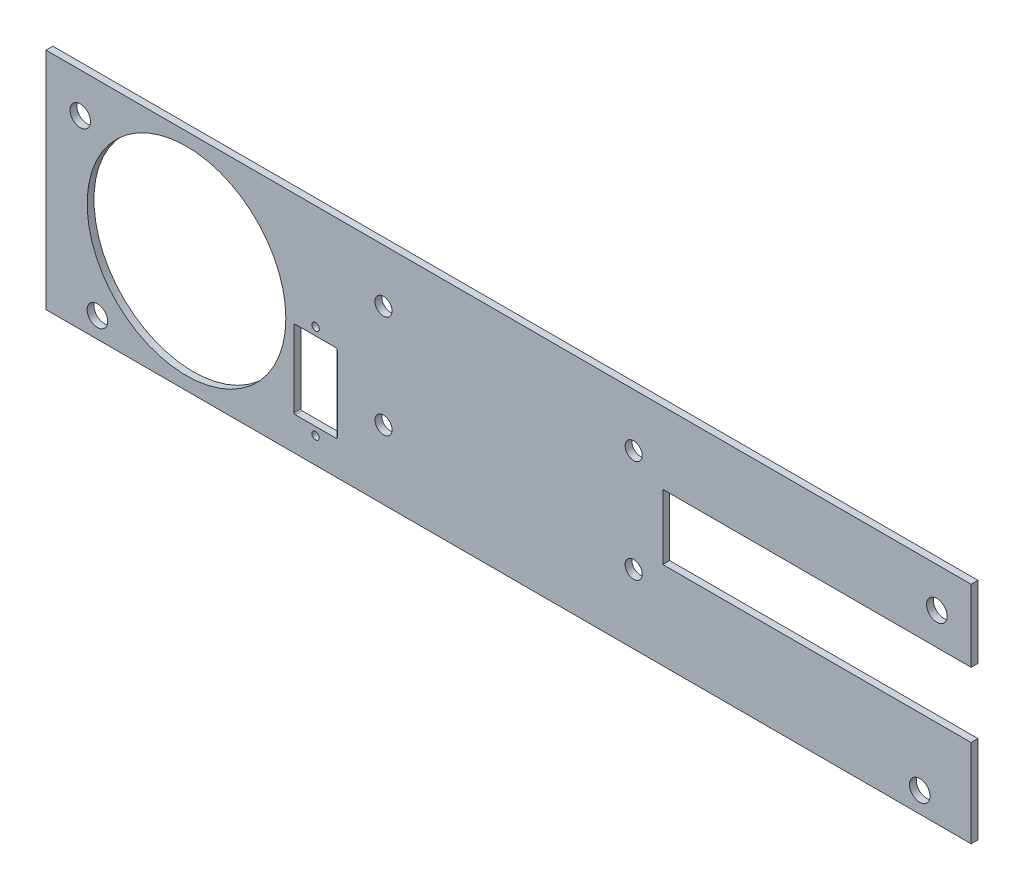
ISO-10303-21;
HEADER;
FILE_DESCRIPTION(('STEP AP214'),'2;1');
FILE_NAME('part.step','',(''),(''),'','','');
FILE_SCHEMA(('AUTOMOTIVE_DESIGN { 1 0 10303 214 1 1 1 1 }'));
ENDSEC;
DATA;
#1=APPLICATION_CONTEXT('core data for automotive mechanical design processes');
#2=APPLICATION_PROTOCOL_DEFINITION('international standard','automotive_design',2000,#1);
#3=PRODUCT_CONTEXT('',#1,'mechanical');
#4=PRODUCT('Part','Part','',(#3));
#5=PRODUCT_RELATED_PRODUCT_CATEGORY('part','',(#4));
#6=PRODUCT_DEFINITION_FORMATION('','',#4);
#7=PRODUCT_DEFINITION_CONTEXT('part definition',#1,'design');
#8=PRODUCT_DEFINITION('design','',#6,#7);
#9=PRODUCT_DEFINITION_SHAPE('','',#8);
#10=(LENGTH_UNIT() NAMED_UNIT(*) SI_UNIT(.MILLI.,.METRE.));
#11=(NAMED_UNIT(*) PLANE_ANGLE_UNIT() SI_UNIT($,.RADIAN.));
#12=(NAMED_UNIT(*) SI_UNIT($,.STERADIAN.) SOLID_ANGLE_UNIT());
#13=UNCERTAINTY_MEASURE_WITH_UNIT(LENGTH_MEASURE(1.E-05),#10,'distance_accuracy_value','');
#14=(GEOMETRIC_REPRESENTATION_CONTEXT(3) GLOBAL_UNCERTAINTY_ASSIGNED_CONTEXT((#13)) GLOBAL_UNIT_ASSIGNED_CONTEXT((#10,
#11,#12)) REPRESENTATION_CONTEXT('',''));
#15=CARTESIAN_POINT('',(0.,0.,0.));
#16=DIRECTION('',(0.,0.,1.));
#17=DIRECTION('',(1.,0.,0.));
#18=AXIS2_PLACEMENT_3D('',#15,#16,#17);
#19=CARTESIAN_POINT('',(135.,30.,2.));
#20=DIRECTION('',(-1.,0.,0.));
#21=DIRECTION('',(0.,0.,1.));
#22=AXIS2_PLACEMENT_3D('',#19,#20,#21);
#23=PLANE('',#22);
#24=DIRECTION('',(0.,1.,0.));
#25=VECTOR('',#24,1.);
#26=CARTESIAN_POINT('',(135.,30.,2.));
#27=LINE('',#26,#25);
#28=CARTESIAN_POINT('',(135.,14.6,2.));
#29=VERTEX_POINT('',#28);
#30=CARTESIAN_POINT('',(135.,35.6,2.));
#31=VERTEX_POINT('',#30);
#32=EDGE_CURVE('E314',#29,#31,#27,.T.);
#33=ORIENTED_EDGE('',*,*,#32,.F.);
#34=DIRECTION('',(0.,0.,-1.));
#35=VECTOR('',#34,1.);
#36=CARTESIAN_POINT('',(135.,14.6,2.));
#37=LINE('',#36,#35);
#38=CARTESIAN_POINT('',(135.,14.6,0.));
#39=VERTEX_POINT('',#38);
#40=EDGE_CURVE('E247',#29,#39,#37,.T.);
#41=ORIENTED_EDGE('',*,*,#40,.T.);
#42=DIRECTION('',(0.,1.,0.));
#43=VECTOR('',#42,1.);
#44=CARTESIAN_POINT('',(135.,30.,0.));
#45=LINE('',#44,#43);
#46=CARTESIAN_POINT('',(135.,35.6,0.));
#47=VERTEX_POINT('',#46);
#48=EDGE_CURVE('E309',#39,#47,#45,.T.);
#49=ORIENTED_EDGE('',*,*,#48,.T.);
#50=DIRECTION('',(0.,0.,1.));
#51=VECTOR('',#50,1.);
#52=CARTESIAN_POINT('',(135.,35.6,0.));
#53=LINE('',#52,#51);
#54=EDGE_CURVE('E303',#47,#31,#53,.T.);
#55=ORIENTED_EDGE('',*,*,#54,.T.);
#56=EDGE_LOOP('',(#33,#41,#49,#55));
#57=FACE_BOUND('',#56,.T.);
#58=ADVANCED_FACE('F33',(#57),#23,.F.);
#59=CARTESIAN_POINT('',(135.,-30.,0.));
#60=VERTEX_POINT('',#59);
#61=CARTESIAN_POINT('',(135.,-4.4,0.));
#62=VERTEX_POINT('',#61);
#63=EDGE_CURVE('E319',#60,#62,#45,.T.);
#64=ORIENTED_EDGE('',*,*,#63,.T.);
#65=DIRECTION('',(0.,0.,1.));
#66=VECTOR('',#65,1.);
#67=CARTESIAN_POINT('',(135.,-4.4,-8.));
#68=LINE('',#67,#66);
#69=CARTESIAN_POINT('',(135.,-4.4,2.));
#70=VERTEX_POINT('',#69);
#71=EDGE_CURVE('E165',#62,#70,#68,.T.);
#72=ORIENTED_EDGE('',*,*,#71,.T.);
#73=CARTESIAN_POINT('',(135.,-30.,2.));
#74=VERTEX_POINT('',#73);
#75=EDGE_CURVE('E171',#74,#70,#27,.T.);
#76=ORIENTED_EDGE('',*,*,#75,.F.);
#77=DIRECTION('',(0.,0.,-1.));
#78=VECTOR('',#77,1.);
#79=CARTESIAN_POINT('',(135.,-30.,2.));
#80=LINE('',#79,#78);
#81=EDGE_CURVE('E318',#74,#60,#80,.T.);
#82=ORIENTED_EDGE('',*,*,#81,.T.);
#83=EDGE_LOOP('',(#64,#72,#76,#82));
#84=FACE_BOUND('',#83,.T.);
#85=ADVANCED_FACE('F35',(#84),#23,.F.);
#86=CARTESIAN_POINT('',(-135.,30.,2.));
#87=DIRECTION('',(1.,0.,0.));
#88=DIRECTION('',(0.,0.,-1.));
#89=AXIS2_PLACEMENT_3D('',#86,#87,#88);
#90=PLANE('',#89);
#91=DIRECTION('',(0.,-1.,0.));
#92=VECTOR('',#91,1.);
#93=CARTESIAN_POINT('',(-135.,30.,0.));
#94=LINE('',#93,#92);
#95=CARTESIAN_POINT('',(-135.,35.6,0.));
#96=VERTEX_POINT('',#95);
#97=CARTESIAN_POINT('',(-135.,-30.,0.));
#98=VERTEX_POINT('',#97);
#99=EDGE_CURVE('E322',#96,#98,#94,.T.);
#100=ORIENTED_EDGE('',*,*,#99,.T.);
#101=DIRECTION('',(0.,0.,-1.));
#102=VECTOR('',#101,1.);
#103=CARTESIAN_POINT('',(-135.,-30.,2.));
#104=LINE('',#103,#102);
#105=CARTESIAN_POINT('',(-135.,-30.,2.));
#106=VERTEX_POINT('',#105);
#107=EDGE_CURVE('E41',#106,#98,#104,.T.);
#108=ORIENTED_EDGE('',*,*,#107,.F.);
#109=DIRECTION('',(0.,-1.,0.));
#110=VECTOR('',#109,1.);
#111=CARTESIAN_POINT('',(-135.,30.,2.));
#112=LINE('',#111,#110);
#113=CARTESIAN_POINT('',(-135.,35.6,2.));
#114=VERTEX_POINT('',#113);
#115=EDGE_CURVE('E313',#114,#106,#112,.T.);
#116=ORIENTED_EDGE('',*,*,#115,.F.);
#117=DIRECTION('',(0.,0.,1.));
#118=VECTOR('',#117,1.);
#119=CARTESIAN_POINT('',(-135.,35.6,0.));
#120=LINE('',#119,#118);
#121=EDGE_CURVE('E306',#96,#114,#120,.T.);
#122=ORIENTED_EDGE('',*,*,#121,.F.);
#123=EDGE_LOOP('',(#100,#108,#116,#122));
#124=FACE_BOUND('',#123,.T.);
#125=ADVANCED_FACE('F354',(#124),#90,.F.);
#126=CARTESIAN_POINT('',(-135.,-30.,2.));
#127=DIRECTION('',(0.,1.,0.));
#128=DIRECTION('',(0.,0.,1.));
#129=AXIS2_PLACEMENT_3D('',#126,#127,#128);
#130=PLANE('',#129);
#131=DIRECTION('',(1.,0.,0.));
#132=VECTOR('',#131,1.);
#133=CARTESIAN_POINT('',(-135.,-30.,0.));
#134=LINE('',#133,#132);
#135=EDGE_CURVE('E324',#98,#60,#134,.T.);
#136=ORIENTED_EDGE('',*,*,#135,.T.);
#137=ORIENTED_EDGE('',*,*,#81,.F.);
#138=DIRECTION('',(1.,0.,0.));
#139=VECTOR('',#138,1.);
#140=CARTESIAN_POINT('',(-135.,-30.,2.));
#141=LINE('',#140,#139);
#142=EDGE_CURVE('E316',#106,#74,#141,.T.);
#143=ORIENTED_EDGE('',*,*,#142,.F.);
#144=ORIENTED_EDGE('',*,*,#107,.T.);
#145=EDGE_LOOP('',(#136,#137,#143,#144));
#146=FACE_BOUND('',#145,.T.);
#147=ADVANCED_FACE('F372',(#146),#130,.F.);
#148=CARTESIAN_POINT('',(0.,0.,2.));
#149=DIRECTION('',(0.,0.,1.));
#150=DIRECTION('',(1.,0.,0.));
#151=AXIS2_PLACEMENT_3D('',#148,#149,#150);
#152=PLANE('',#151);
#153=DIRECTION('',(1.,0.,0.));
#154=VECTOR('',#153,1.);
#155=CARTESIAN_POINT('',(135.,-4.4,2.));
#156=LINE('',#155,#154);
#157=CARTESIAN_POINT('',(45.,-4.40000000000001,2.));
#158=VERTEX_POINT('',#157);
#159=EDGE_CURVE('E163',#158,#70,#156,.T.);
#160=ORIENTED_EDGE('',*,*,#159,.F.);
#161=DIRECTION('',(0.,1.,0.));
#162=VECTOR('',#161,1.);
#163=CARTESIAN_POINT('',(45.,4.6,2.));
#164=LINE('',#163,#162);
#165=CARTESIAN_POINT('',(45.,14.6,2.));
#166=VERTEX_POINT('',#165);
#167=EDGE_CURVE('E147',#158,#166,#164,.T.);
#168=ORIENTED_EDGE('',*,*,#167,.T.);
#169=DIRECTION('',(1.,0.,0.));
#170=VECTOR('',#169,1.);
#171=CARTESIAN_POINT('',(135.,14.6,2.));
#172=LINE('',#171,#170);
#173=EDGE_CURVE('E157',#166,#29,#172,.T.);
#174=ORIENTED_EDGE('',*,*,#173,.T.);
#175=ORIENTED_EDGE('',*,*,#32,.T.);
#176=DIRECTION('',(-1.,0.,0.));
#177=VECTOR('',#176,1.);
#178=CARTESIAN_POINT('',(-135.,35.6,2.));
#179=LINE('',#178,#177);
#180=EDGE_CURVE('E297',#31,#114,#179,.T.);
#181=ORIENTED_EDGE('',*,*,#180,.T.);
#182=ORIENTED_EDGE('',*,*,#115,.T.);
#183=ORIENTED_EDGE('',*,*,#142,.T.);
#184=ORIENTED_EDGE('',*,*,#75,.T.);
#185=EDGE_LOOP('',(#160,#168,#174,#175,#181,#182,#183,#184));
#186=FACE_BOUND('',#185,.T.);
#187=CARTESIAN_POINT('',(-56.3119000000001,-22.5108,2.));
#188=DIRECTION('',(0.,0.,1.));
#189=DIRECTION('',(1.,0.,0.));
#190=AXIS2_PLACEMENT_3D('',#187,#188,#189);
#191=CIRCLE('',#190,1.06680000000001);
#192=CARTESIAN_POINT('',(-55.2451000000001,-22.5108,2.));
#193=VERTEX_POINT('',#192);
#194=EDGE_CURVE('E184',#193,#193,#191,.T.);
#195=ORIENTED_EDGE('',*,*,#194,.F.);
#196=EDGE_LOOP('',(#195));
#197=FACE_BOUND('',#196,.T.);
#198=CARTESIAN_POINT('',(-56.3119,5.0228,2.));
#199=DIRECTION('',(0.,0.,1.));
#200=DIRECTION('',(1.,0.,0.));
#201=AXIS2_PLACEMENT_3D('',#198,#199,#200);
#202=CIRCLE('',#201,1.06680000000002);
#203=CARTESIAN_POINT('',(-55.2451,5.0228,2.));
#204=VERTEX_POINT('',#203);
#205=EDGE_CURVE('E179',#204,#204,#202,.T.);
#206=ORIENTED_EDGE('',*,*,#205,.F.);
#207=EDGE_LOOP('',(#206));
#208=FACE_BOUND('',#207,.T.);
#209=CARTESIAN_POINT('',(-62.2428000000001,2.30499999999999,2.));
#210=DIRECTION('',(0.,0.,1.));
#211=DIRECTION('',(1.,0.,0.));
#212=AXIS2_PLACEMENT_3D('',#209,#210,#211);
#213=CIRCLE('',#212,0.380999999999999);
#214=CARTESIAN_POINT('',(-62.2428,2.68599999999999,2.));
#215=VERTEX_POINT('',#214);
#216=CARTESIAN_POINT('',(-62.6238,2.30499999999999,2.));
#217=VERTEX_POINT('',#216);
#218=EDGE_CURVE('E237',#215,#217,#213,.T.);
#219=ORIENTED_EDGE('',*,*,#218,.F.);
#220=DIRECTION('',(-1.,0.,0.));
#221=VECTOR('',#220,1.);
#222=CARTESIAN_POINT('',(0.,2.68599999999999,2.));
#223=LINE('',#222,#221);
#224=CARTESIAN_POINT('',(-50.381,2.68599999999999,2.));
#225=VERTEX_POINT('',#224);
#226=EDGE_CURVE('E211',#225,#215,#223,.T.);
#227=ORIENTED_EDGE('',*,*,#226,.F.);
#228=CARTESIAN_POINT('',(-50.381,2.30499999999999,2.));
#229=DIRECTION('',(0.,0.,1.));
#230=DIRECTION('',(1.,0.,0.));
#231=AXIS2_PLACEMENT_3D('',#228,#229,#230);
#232=CIRCLE('',#231,0.380999999999999);
#233=CARTESIAN_POINT('',(-50.,2.30499999999999,2.));
#234=VERTEX_POINT('',#233);
#235=EDGE_CURVE('E225',#234,#225,#232,.T.);
#236=ORIENTED_EDGE('',*,*,#235,.F.);
#237=DIRECTION('',(0.,1.,0.));
#238=VECTOR('',#237,1.);
#239=CARTESIAN_POINT('',(-50.,0.,2.));
#240=LINE('',#239,#238);
#241=CARTESIAN_POINT('',(-50.,-19.793,2.));
#242=VERTEX_POINT('',#241);
#243=EDGE_CURVE('E227',#242,#234,#240,.T.);
#244=ORIENTED_EDGE('',*,*,#243,.F.);
#245=CARTESIAN_POINT('',(-50.381,-19.793,2.));
#246=DIRECTION('',(0.,0.,1.));
#247=DIRECTION('',(1.,0.,0.));
#248=AXIS2_PLACEMENT_3D('',#245,#246,#247);
#249=CIRCLE('',#248,0.380999999999999);
#250=CARTESIAN_POINT('',(-50.381,-20.174,2.));
#251=VERTEX_POINT('',#250);
#252=EDGE_CURVE('E229',#251,#242,#249,.T.);
#253=ORIENTED_EDGE('',*,*,#252,.F.);
#254=DIRECTION('',(1.,0.,0.));
#255=VECTOR('',#254,1.);
#256=CARTESIAN_POINT('',(0.,-20.174,2.));
#257=LINE('',#256,#255);
#258=CARTESIAN_POINT('',(-62.2428000000001,-20.174,2.));
#259=VERTEX_POINT('',#258);
#260=EDGE_CURVE('E231',#259,#251,#257,.T.);
#261=ORIENTED_EDGE('',*,*,#260,.F.);
#262=CARTESIAN_POINT('',(-62.2428000000001,-19.793,2.));
#263=DIRECTION('',(0.,0.,1.));
#264=DIRECTION('',(1.,0.,0.));
#265=AXIS2_PLACEMENT_3D('',#262,#263,#264);
#266=CIRCLE('',#265,0.380999999999999);
#267=CARTESIAN_POINT('',(-62.6238,-19.793,2.));
#268=VERTEX_POINT('',#267);
#269=EDGE_CURVE('E233',#268,#259,#266,.T.);
#270=ORIENTED_EDGE('',*,*,#269,.F.);
#271=DIRECTION('',(0.,-1.,0.));
#272=VECTOR('',#271,1.);
#273=CARTESIAN_POINT('',(-62.6238,0.,2.));
#274=LINE('',#273,#272);
#275=EDGE_CURVE('E235',#217,#268,#274,.T.);
#276=ORIENTED_EDGE('',*,*,#275,.F.);
#277=EDGE_LOOP('',(#219,#227,#236,#244,#253,#261,#270,#276));
#278=FACE_BOUND('',#277,.T.);
#279=CARTESIAN_POINT('',(-94.,2.8,2.));
#280=DIRECTION('',(0.,0.,1.));
#281=DIRECTION('',(1.,0.,0.));
#282=AXIS2_PLACEMENT_3D('',#279,#280,#281);
#283=CIRCLE('',#282,29.);
#284=CARTESIAN_POINT('',(-65.,2.8,2.));
#285=VERTEX_POINT('',#284);
#286=EDGE_CURVE('E239',#285,#285,#283,.T.);
#287=ORIENTED_EDGE('',*,*,#286,.F.);
#288=EDGE_LOOP('',(#287));
#289=FACE_BOUND('',#288,.T.);
#290=CARTESIAN_POINT('',(120.,-24.,2.));
#291=DIRECTION('',(0.,0.,-1.));
#292=DIRECTION('',(-1.,0.,0.));
#293=AXIS2_PLACEMENT_3D('',#290,#291,#292);
#294=CIRCLE('',#293,3.00000000000001);
#295=CARTESIAN_POINT('',(117.,-24.,2.));
#296=VERTEX_POINT('',#295);
#297=EDGE_CURVE('E271',#296,#296,#294,.T.);
#298=ORIENTED_EDGE('',*,*,#297,.T.);
#299=EDGE_LOOP('',(#298));
#300=FACE_BOUND('',#299,.T.);
#301=CARTESIAN_POINT('',(125.,24.,2.));
#302=DIRECTION('',(0.,0.,-1.));
#303=DIRECTION('',(-1.,0.,0.));
#304=AXIS2_PLACEMENT_3D('',#301,#302,#303);
#305=CIRCLE('',#304,2.99999999999996);
#306=CARTESIAN_POINT('',(122.,24.,2.));
#307=VERTEX_POINT('',#306);
#308=EDGE_CURVE('E265',#307,#307,#305,.T.);
#309=ORIENTED_EDGE('',*,*,#308,.T.);
#310=EDGE_LOOP('',(#309));
#311=FACE_BOUND('',#310,.T.);
#312=CARTESIAN_POINT('',(-120.,-24.,2.));
#313=DIRECTION('',(0.,0.,-1.));
#314=DIRECTION('',(-1.,0.,0.));
#315=AXIS2_PLACEMENT_3D('',#312,#313,#314);
#316=CIRCLE('',#315,3.00000000000002);
#317=CARTESIAN_POINT('',(-123.,-24.,2.));
#318=VERTEX_POINT('',#317);
#319=EDGE_CURVE('E259',#318,#318,#316,.T.);
#320=ORIENTED_EDGE('',*,*,#319,.T.);
#321=EDGE_LOOP('',(#320));
#322=FACE_BOUND('',#321,.T.);
#323=CARTESIAN_POINT('',(-125.,24.,2.));
#324=DIRECTION('',(0.,0.,-1.));
#325=DIRECTION('',(-1.,0.,0.));
#326=AXIS2_PLACEMENT_3D('',#323,#324,#325);
#327=CIRCLE('',#326,3.00000000000014);
#328=CARTESIAN_POINT('',(-128.,24.,2.));
#329=VERTEX_POINT('',#328);
#330=EDGE_CURVE('E252',#329,#329,#327,.T.);
#331=ORIENTED_EDGE('',*,*,#330,.T.);
#332=EDGE_LOOP('',(#331));
#333=FACE_BOUND('',#332,.T.);
#334=CARTESIAN_POINT('',(-36.5,20.1247090667257,2.));
#335=DIRECTION('',(0.,0.,-1.));
#336=DIRECTION('',(-1.,0.,0.));
#337=AXIS2_PLACEMENT_3D('',#334,#335,#336);
#338=CIRCLE('',#337,2.50000000000001);
#339=CARTESIAN_POINT('',(-39.,20.1247090667257,2.));
#340=VERTEX_POINT('',#339);
#341=EDGE_CURVE('E289',#340,#340,#338,.T.);
#342=ORIENTED_EDGE('',*,*,#341,.T.);
#343=EDGE_LOOP('',(#342));
#344=FACE_BOUND('',#343,.T.);
#345=CARTESIAN_POINT('',(-36.5,-9.87529093327427,2.));
#346=DIRECTION('',(0.,0.,-1.));
#347=DIRECTION('',(-1.,0.,0.));
#348=AXIS2_PLACEMENT_3D('',#345,#346,#347);
#349=CIRCLE('',#348,2.49999999999999);
#350=CARTESIAN_POINT('',(-39.,-9.87529093327427,2.));
#351=VERTEX_POINT('',#350);
#352=EDGE_CURVE('E283',#351,#351,#349,.T.);
#353=ORIENTED_EDGE('',*,*,#352,.T.);
#354=EDGE_LOOP('',(#353));
#355=FACE_BOUND('',#354,.T.);
#356=CARTESIAN_POINT('',(36.5,-9.87529093327427,2.));
#357=DIRECTION('',(0.,0.,-1.));
#358=DIRECTION('',(-1.,0.,0.));
#359=AXIS2_PLACEMENT_3D('',#356,#357,#358);
#360=CIRCLE('',#359,2.49999999999999);
#361=CARTESIAN_POINT('',(34.,-9.87529093327427,2.));
#362=VERTEX_POINT('',#361);
#363=EDGE_CURVE('E276',#362,#362,#360,.T.);
#364=ORIENTED_EDGE('',*,*,#363,.T.);
#365=EDGE_LOOP('',(#364));
#366=FACE_BOUND('',#365,.T.);
#367=CARTESIAN_POINT('',(36.5,20.1247090667257,2.));
#368=DIRECTION('',(0.,0.,-1.));
#369=DIRECTION('',(-1.,0.,0.));
#370=AXIS2_PLACEMENT_3D('',#367,#368,#369);
#371=CIRCLE('',#370,2.5);
#372=CARTESIAN_POINT('',(34.,20.1247090667257,2.));
#373=VERTEX_POINT('',#372);
#374=EDGE_CURVE('E294',#373,#373,#371,.T.);
#375=ORIENTED_EDGE('',*,*,#374,.T.);
#376=EDGE_LOOP('',(#375));
#377=FACE_BOUND('',#376,.T.);
#378=ADVANCED_FACE('F168',(#186,#197,#208,#278,#289,#300,#311,#322,#333,#344,#355,#366,#377),
#152,.T.);
#379=CARTESIAN_POINT('',(0.,0.,0.));
#380=DIRECTION('',(0.,0.,1.));
#381=DIRECTION('',(1.,0.,0.));
#382=AXIS2_PLACEMENT_3D('',#379,#380,#381);
#383=PLANE('',#382);
#384=CARTESIAN_POINT('',(-56.3119000000001,-22.5108,0.));
#385=DIRECTION('',(0.,0.,-1.));
#386=DIRECTION('',(-1.,0.,0.));
#387=AXIS2_PLACEMENT_3D('',#384,#385,#386);
#388=CIRCLE('',#387,1.06680000000001);
#389=CARTESIAN_POINT('',(-57.3787000000001,-22.5108,0.));
#390=VERTEX_POINT('',#389);
#391=EDGE_CURVE('E176',#390,#390,#388,.T.);
#392=ORIENTED_EDGE('',*,*,#391,.F.);
#393=EDGE_LOOP('',(#392));
#394=FACE_BOUND('',#393,.T.);
#395=CARTESIAN_POINT('',(-56.3119,5.0228,0.));
#396=DIRECTION('',(0.,0.,-1.));
#397=DIRECTION('',(-1.,0.,0.));
#398=AXIS2_PLACEMENT_3D('',#395,#396,#397);
#399=CIRCLE('',#398,1.06680000000002);
#400=CARTESIAN_POINT('',(-57.3787000000001,5.0228,0.));
#401=VERTEX_POINT('',#400);
#402=EDGE_CURVE('E174',#401,#401,#399,.T.);
#403=ORIENTED_EDGE('',*,*,#402,.F.);
#404=EDGE_LOOP('',(#403));
#405=FACE_BOUND('',#404,.T.);
#406=DIRECTION('',(1.,0.,0.));
#407=VECTOR('',#406,1.);
#408=CARTESIAN_POINT('',(-62.2428,2.68599999999999,0.));
#409=LINE('',#408,#407);
#410=CARTESIAN_POINT('',(-62.2428,2.68599999999999,0.));
#411=VERTEX_POINT('',#410);
#412=CARTESIAN_POINT('',(-50.381,2.68599999999999,0.));
#413=VERTEX_POINT('',#412);
#414=EDGE_CURVE('E188',#411,#413,#409,.T.);
#415=ORIENTED_EDGE('',*,*,#414,.F.);
#416=CARTESIAN_POINT('',(-62.2428000000001,2.30499999999999,0.));
#417=DIRECTION('',(0.,0.,-1.));
#418=DIRECTION('',(-1.,0.,0.));
#419=AXIS2_PLACEMENT_3D('',#416,#417,#418);
#420=CIRCLE('',#419,0.380999999999999);
#421=CARTESIAN_POINT('',(-62.6238,2.30499999999999,0.));
#422=VERTEX_POINT('',#421);
#423=EDGE_CURVE('E56',#422,#411,#420,.T.);
#424=ORIENTED_EDGE('',*,*,#423,.F.);
#425=DIRECTION('',(0.,1.,0.));
#426=VECTOR('',#425,1.);
#427=CARTESIAN_POINT('',(-62.6238,-19.793,0.));
#428=LINE('',#427,#426);
#429=CARTESIAN_POINT('',(-62.6238,-19.793,0.));
#430=VERTEX_POINT('',#429);
#431=EDGE_CURVE('E205',#430,#422,#428,.T.);
#432=ORIENTED_EDGE('',*,*,#431,.F.);
#433=CARTESIAN_POINT('',(-62.2428000000001,-19.793,0.));
#434=DIRECTION('',(0.,0.,-1.));
#435=DIRECTION('',(-1.,0.,0.));
#436=AXIS2_PLACEMENT_3D('',#433,#434,#435);
#437=CIRCLE('',#436,0.380999999999999);
#438=CARTESIAN_POINT('',(-62.2428000000001,-20.174,0.));
#439=VERTEX_POINT('',#438);
#440=EDGE_CURVE('E202',#439,#430,#437,.T.);
#441=ORIENTED_EDGE('',*,*,#440,.F.);
#442=DIRECTION('',(-1.,0.,0.));
#443=VECTOR('',#442,1.);
#444=CARTESIAN_POINT('',(-50.381,-20.174,0.));
#445=LINE('',#444,#443);
#446=CARTESIAN_POINT('',(-50.381,-20.174,0.));
#447=VERTEX_POINT('',#446);
#448=EDGE_CURVE('E199',#447,#439,#445,.T.);
#449=ORIENTED_EDGE('',*,*,#448,.F.);
#450=CARTESIAN_POINT('',(-50.381,-19.793,0.));
#451=DIRECTION('',(0.,0.,-1.));
#452=DIRECTION('',(-1.,0.,0.));
#453=AXIS2_PLACEMENT_3D('',#450,#451,#452);
#454=CIRCLE('',#453,0.380999999999999);
#455=CARTESIAN_POINT('',(-50.,-19.793,0.));
#456=VERTEX_POINT('',#455);
#457=EDGE_CURVE('E196',#456,#447,#454,.T.);
#458=ORIENTED_EDGE('',*,*,#457,.F.);
#459=DIRECTION('',(0.,-1.,0.));
#460=VECTOR('',#459,1.);
#461=CARTESIAN_POINT('',(-50.,2.30499999999999,0.));
#462=LINE('',#461,#460);
#463=CARTESIAN_POINT('',(-50.,2.30499999999999,0.));
#464=VERTEX_POINT('',#463);
#465=EDGE_CURVE('E193',#464,#456,#462,.T.);
#466=ORIENTED_EDGE('',*,*,#465,.F.);
#467=CARTESIAN_POINT('',(-50.381,2.30499999999999,0.));
#468=DIRECTION('',(0.,0.,-1.));
#469=DIRECTION('',(-1.,0.,0.));
#470=AXIS2_PLACEMENT_3D('',#467,#468,#469);
#471=CIRCLE('',#470,0.380999999999999);
#472=EDGE_CURVE('E190',#413,#464,#471,.T.);
#473=ORIENTED_EDGE('',*,*,#472,.F.);
#474=EDGE_LOOP('',(#415,#424,#432,#441,#449,#458,#466,#473));
#475=FACE_BOUND('',#474,.T.);
#476=CARTESIAN_POINT('',(-94.,2.8,0.));
#477=DIRECTION('',(0.,0.,1.));
#478=DIRECTION('',(1.,0.,0.));
#479=AXIS2_PLACEMENT_3D('',#476,#477,#478);
#480=CIRCLE('',#479,29.);
#481=CARTESIAN_POINT('',(-65.,2.8,0.));
#482=VERTEX_POINT('',#481);
#483=EDGE_CURVE('E241',#482,#482,#480,.T.);
#484=ORIENTED_EDGE('',*,*,#483,.T.);
#485=EDGE_LOOP('',(#484));
#486=FACE_BOUND('',#485,.T.);
#487=CARTESIAN_POINT('',(120.,-24.,0.));
#488=DIRECTION('',(0.,0.,-1.));
#489=DIRECTION('',(-1.,0.,0.));
#490=AXIS2_PLACEMENT_3D('',#487,#488,#489);
#491=CIRCLE('',#490,3.00000000000001);
#492=CARTESIAN_POINT('',(117.,-24.,0.));
#493=VERTEX_POINT('',#492);
#494=EDGE_CURVE('E250',#493,#493,#491,.T.);
#495=ORIENTED_EDGE('',*,*,#494,.F.);
#496=EDGE_LOOP('',(#495));
#497=FACE_BOUND('',#496,.T.);
#498=CARTESIAN_POINT('',(125.,24.,0.));
#499=DIRECTION('',(0.,0.,-1.));
#500=DIRECTION('',(-1.,0.,0.));
#501=AXIS2_PLACEMENT_3D('',#498,#499,#500);
#502=CIRCLE('',#501,2.99999999999996);
#503=CARTESIAN_POINT('',(122.,24.,0.));
#504=VERTEX_POINT('',#503);
#505=EDGE_CURVE('E268',#504,#504,#502,.T.);
#506=ORIENTED_EDGE('',*,*,#505,.F.);
#507=EDGE_LOOP('',(#506));
#508=FACE_BOUND('',#507,.T.);
#509=CARTESIAN_POINT('',(-120.,-24.,0.));
#510=DIRECTION('',(0.,0.,-1.));
#511=DIRECTION('',(-1.,0.,0.));
#512=AXIS2_PLACEMENT_3D('',#509,#510,#511);
#513=CIRCLE('',#512,3.00000000000002);
#514=CARTESIAN_POINT('',(-123.,-24.,0.));
#515=VERTEX_POINT('',#514);
#516=EDGE_CURVE('E262',#515,#515,#513,.T.);
#517=ORIENTED_EDGE('',*,*,#516,.F.);
#518=EDGE_LOOP('',(#517));
#519=FACE_BOUND('',#518,.T.);
#520=CARTESIAN_POINT('',(-125.,24.,0.));
#521=DIRECTION('',(0.,0.,-1.));
#522=DIRECTION('',(-1.,0.,0.));
#523=AXIS2_PLACEMENT_3D('',#520,#521,#522);
#524=CIRCLE('',#523,3.00000000000014);
#525=CARTESIAN_POINT('',(-128.,24.,0.));
#526=VERTEX_POINT('',#525);
#527=EDGE_CURVE('E256',#526,#526,#524,.T.);
#528=ORIENTED_EDGE('',*,*,#527,.F.);
#529=EDGE_LOOP('',(#528));
#530=FACE_BOUND('',#529,.T.);
#531=CARTESIAN_POINT('',(-36.5,20.1247090667257,0.));
#532=DIRECTION('',(0.,0.,-1.));
#533=DIRECTION('',(-1.,0.,0.));
#534=AXIS2_PLACEMENT_3D('',#531,#532,#533);
#535=CIRCLE('',#534,2.50000000000001);
#536=CARTESIAN_POINT('',(-39.,20.1247090667257,0.));
#537=VERTEX_POINT('',#536);
#538=EDGE_CURVE('E255',#537,#537,#535,.T.);
#539=ORIENTED_EDGE('',*,*,#538,.F.);
#540=EDGE_LOOP('',(#539));
#541=FACE_BOUND('',#540,.T.);
#542=CARTESIAN_POINT('',(-36.5,-9.87529093327427,0.));
#543=DIRECTION('',(0.,0.,-1.));
#544=DIRECTION('',(-1.,0.,0.));
#545=AXIS2_PLACEMENT_3D('',#542,#543,#544);
#546=CIRCLE('',#545,2.49999999999999);
#547=CARTESIAN_POINT('',(-39.,-9.87529093327427,0.));
#548=VERTEX_POINT('',#547);
#549=EDGE_CURVE('E286',#548,#548,#546,.T.);
#550=ORIENTED_EDGE('',*,*,#549,.F.);
#551=EDGE_LOOP('',(#550));
#552=FACE_BOUND('',#551,.T.);
#553=CARTESIAN_POINT('',(36.5,-9.87529093327427,0.));
#554=DIRECTION('',(0.,0.,-1.));
#555=DIRECTION('',(-1.,0.,0.));
#556=AXIS2_PLACEMENT_3D('',#553,#554,#555);
#557=CIRCLE('',#556,2.49999999999999);
#558=CARTESIAN_POINT('',(34.,-9.87529093327427,0.));
#559=VERTEX_POINT('',#558);
#560=EDGE_CURVE('E280',#559,#559,#557,.T.);
#561=ORIENTED_EDGE('',*,*,#560,.F.);
#562=EDGE_LOOP('',(#561));
#563=FACE_BOUND('',#562,.T.);
#564=CARTESIAN_POINT('',(36.5,20.1247090667257,0.));
#565=DIRECTION('',(0.,0.,-1.));
#566=DIRECTION('',(-1.,0.,0.));
#567=AXIS2_PLACEMENT_3D('',#564,#565,#566);
#568=CIRCLE('',#567,2.5);
#569=CARTESIAN_POINT('',(34.,20.1247090667257,0.));
#570=VERTEX_POINT('',#569);
#571=EDGE_CURVE('E279',#570,#570,#568,.T.);
#572=ORIENTED_EDGE('',*,*,#571,.F.);
#573=EDGE_LOOP('',(#572));
#574=FACE_BOUND('',#573,.T.);
#575=DIRECTION('',(0.,1.,0.));
#576=VECTOR('',#575,1.);
#577=CARTESIAN_POINT('',(45.,4.6,0.));
#578=LINE('',#577,#576);
#579=CARTESIAN_POINT('',(45.,-4.40000000000001,0.));
#580=VERTEX_POINT('',#579);
#581=CARTESIAN_POINT('',(45.,14.6,0.));
#582=VERTEX_POINT('',#581);
#583=EDGE_CURVE('E244',#580,#582,#578,.T.);
#584=ORIENTED_EDGE('',*,*,#583,.F.);
#585=DIRECTION('',(1.,0.,0.));
#586=VECTOR('',#585,1.);
#587=CARTESIAN_POINT('',(0.,-4.40000000000002,0.));
#588=LINE('',#587,#586);
#589=EDGE_CURVE('E11',#580,#62,#588,.T.);
#590=ORIENTED_EDGE('',*,*,#589,.T.);
#591=ORIENTED_EDGE('',*,*,#63,.F.);
#592=ORIENTED_EDGE('',*,*,#135,.F.);
#593=ORIENTED_EDGE('',*,*,#99,.F.);
#594=DIRECTION('',(-1.,0.,0.));
#595=VECTOR('',#594,1.);
#596=CARTESIAN_POINT('',(-135.,35.6,0.));
#597=LINE('',#596,#595);
#598=EDGE_CURVE('E300',#47,#96,#597,.T.);
#599=ORIENTED_EDGE('',*,*,#598,.F.);
#600=ORIENTED_EDGE('',*,*,#48,.F.);
#601=DIRECTION('',(1.,0.,0.));
#602=VECTOR('',#601,1.);
#603=CARTESIAN_POINT('',(135.,14.6,0.));
#604=LINE('',#603,#602);
#605=EDGE_CURVE('E158',#582,#39,#604,.T.);
#606=ORIENTED_EDGE('',*,*,#605,.F.);
#607=EDGE_LOOP('',(#584,#590,#591,#592,#593,#599,#600,#606));
#608=FACE_BOUND('',#607,.T.);
#609=ADVANCED_FACE('F332',(#394,#405,#475,#486,#497,#508,#519,#530,#541,#552,#563,#574,#608),
#383,.F.);
#610=CARTESIAN_POINT('',(-135.,35.6,0.));
#611=DIRECTION('',(0.,1.,0.));
#612=DIRECTION('',(0.,0.,1.));
#613=AXIS2_PLACEMENT_3D('',#610,#611,#612);
#614=PLANE('',#613);
#615=ORIENTED_EDGE('',*,*,#180,.F.);
#616=ORIENTED_EDGE('',*,*,#54,.F.);
#617=ORIENTED_EDGE('',*,*,#598,.T.);
#618=ORIENTED_EDGE('',*,*,#121,.T.);
#619=EDGE_LOOP('',(#615,#616,#617,#618));
#620=FACE_BOUND('',#619,.T.);
#621=ADVANCED_FACE('F365',(#620),#614,.T.);
#622=CARTESIAN_POINT('',(36.5,20.1247090667257,2.));
#623=DIRECTION('',(0.,0.,-1.));
#624=DIRECTION('',(-1.,0.,0.));
#625=AXIS2_PLACEMENT_3D('',#622,#623,#624);
#626=CYLINDRICAL_SURFACE('',#625,2.5);
#627=ORIENTED_EDGE('',*,*,#374,.F.);
#628=EDGE_LOOP('',(#627));
#629=FACE_BOUND('',#628,.T.);
#630=ORIENTED_EDGE('',*,*,#571,.T.);
#631=EDGE_LOOP('',(#630));
#632=FACE_BOUND('',#631,.T.);
#633=ADVANCED_FACE('F388',(#629,#632),#626,.F.);
#634=CARTESIAN_POINT('',(36.5,-9.87529093327427,2.));
#635=DIRECTION('',(0.,0.,-1.));
#636=DIRECTION('',(-1.,0.,0.));
#637=AXIS2_PLACEMENT_3D('',#634,#635,#636);
#638=CYLINDRICAL_SURFACE('',#637,2.49999999999999);
#639=ORIENTED_EDGE('',*,*,#363,.F.);
#640=EDGE_LOOP('',(#639));
#641=FACE_BOUND('',#640,.T.);
#642=ORIENTED_EDGE('',*,*,#560,.T.);
#643=EDGE_LOOP('',(#642));
#644=FACE_BOUND('',#643,.T.);
#645=ADVANCED_FACE('F391',(#641,#644),#638,.F.);
#646=CARTESIAN_POINT('',(-36.5,-9.87529093327427,2.));
#647=DIRECTION('',(0.,0.,-1.));
#648=DIRECTION('',(-1.,0.,0.));
#649=AXIS2_PLACEMENT_3D('',#646,#647,#648);
#650=CYLINDRICAL_SURFACE('',#649,2.49999999999999);
#651=ORIENTED_EDGE('',*,*,#352,.F.);
#652=EDGE_LOOP('',(#651));
#653=FACE_BOUND('',#652,.T.);
#654=ORIENTED_EDGE('',*,*,#549,.T.);
#655=EDGE_LOOP('',(#654));
#656=FACE_BOUND('',#655,.T.);
#657=ADVANCED_FACE('F397',(#653,#656),#650,.F.);
#658=CARTESIAN_POINT('',(-36.5,20.1247090667257,2.));
#659=DIRECTION('',(0.,0.,-1.));
#660=DIRECTION('',(-1.,0.,0.));
#661=AXIS2_PLACEMENT_3D('',#658,#659,#660);
#662=CYLINDRICAL_SURFACE('',#661,2.50000000000001);
#663=ORIENTED_EDGE('',*,*,#341,.F.);
#664=EDGE_LOOP('',(#663));
#665=FACE_BOUND('',#664,.T.);
#666=ORIENTED_EDGE('',*,*,#538,.T.);
#667=EDGE_LOOP('',(#666));
#668=FACE_BOUND('',#667,.T.);
#669=ADVANCED_FACE('F393',(#665,#668),#662,.F.);
#670=CARTESIAN_POINT('',(-125.,24.,2.));
#671=DIRECTION('',(0.,0.,-1.));
#672=DIRECTION('',(-1.,0.,0.));
#673=AXIS2_PLACEMENT_3D('',#670,#671,#672);
#674=CYLINDRICAL_SURFACE('',#673,3.00000000000014);
#675=ORIENTED_EDGE('',*,*,#330,.F.);
#676=EDGE_LOOP('',(#675));
#677=FACE_BOUND('',#676,.T.);
#678=ORIENTED_EDGE('',*,*,#527,.T.);
#679=EDGE_LOOP('',(#678));
#680=FACE_BOUND('',#679,.T.);
#681=ADVANCED_FACE('F396',(#677,#680),#674,.F.);
#682=CARTESIAN_POINT('',(-120.,-24.,2.));
#683=DIRECTION('',(0.,0.,-1.));
#684=DIRECTION('',(-1.,0.,0.));
#685=AXIS2_PLACEMENT_3D('',#682,#683,#684);
#686=CYLINDRICAL_SURFACE('',#685,3.00000000000002);
#687=ORIENTED_EDGE('',*,*,#319,.F.);
#688=EDGE_LOOP('',(#687));
#689=FACE_BOUND('',#688,.T.);
#690=ORIENTED_EDGE('',*,*,#516,.T.);
#691=EDGE_LOOP('',(#690));
#692=FACE_BOUND('',#691,.T.);
#693=ADVANCED_FACE('F412',(#689,#692),#686,.F.);
#694=CARTESIAN_POINT('',(125.,24.,2.));
#695=DIRECTION('',(0.,0.,-1.));
#696=DIRECTION('',(-1.,0.,0.));
#697=AXIS2_PLACEMENT_3D('',#694,#695,#696);
#698=CYLINDRICAL_SURFACE('',#697,2.99999999999996);
#699=ORIENTED_EDGE('',*,*,#308,.F.);
#700=EDGE_LOOP('',(#699));
#701=FACE_BOUND('',#700,.T.);
#702=ORIENTED_EDGE('',*,*,#505,.T.);
#703=EDGE_LOOP('',(#702));
#704=FACE_BOUND('',#703,.T.);
#705=ADVANCED_FACE('F408',(#701,#704),#698,.F.);
#706=CARTESIAN_POINT('',(120.,-24.,2.));
#707=DIRECTION('',(0.,0.,-1.));
#708=DIRECTION('',(-1.,0.,0.));
#709=AXIS2_PLACEMENT_3D('',#706,#707,#708);
#710=CYLINDRICAL_SURFACE('',#709,3.00000000000001);
#711=ORIENTED_EDGE('',*,*,#297,.F.);
#712=EDGE_LOOP('',(#711));
#713=FACE_BOUND('',#712,.T.);
#714=ORIENTED_EDGE('',*,*,#494,.T.);
#715=EDGE_LOOP('',(#714));
#716=FACE_BOUND('',#715,.T.);
#717=ADVANCED_FACE('F405',(#713,#716),#710,.F.);
#718=CARTESIAN_POINT('',(135.,14.6,2.));
#719=DIRECTION('',(0.,1.,0.));
#720=DIRECTION('',(0.,0.,1.));
#721=AXIS2_PLACEMENT_3D('',#718,#719,#720);
#722=PLANE('',#721);
#723=ORIENTED_EDGE('',*,*,#605,.T.);
#724=ORIENTED_EDGE('',*,*,#40,.F.);
#725=ORIENTED_EDGE('',*,*,#173,.F.);
#726=DIRECTION('',(0.,0.,-1.));
#727=VECTOR('',#726,1.);
#728=CARTESIAN_POINT('',(45.,14.6,2.));
#729=LINE('',#728,#727);
#730=EDGE_CURVE('E152',#166,#582,#729,.T.);
#731=ORIENTED_EDGE('',*,*,#730,.T.);
#732=EDGE_LOOP('',(#723,#724,#725,#731));
#733=FACE_BOUND('',#732,.T.);
#734=ADVANCED_FACE('F346',(#733),#722,.F.);
#735=CARTESIAN_POINT('',(45.,4.6,2.));
#736=DIRECTION('',(-1.,0.,0.));
#737=DIRECTION('',(0.,0.,1.));
#738=AXIS2_PLACEMENT_3D('',#735,#736,#737);
#739=PLANE('',#738);
#740=ORIENTED_EDGE('',*,*,#583,.T.);
#741=ORIENTED_EDGE('',*,*,#730,.F.);
#742=ORIENTED_EDGE('',*,*,#167,.F.);
#743=DIRECTION('',(0.,0.,1.));
#744=VECTOR('',#743,1.);
#745=CARTESIAN_POINT('',(45.,-4.40000000000001,-8.));
#746=LINE('',#745,#744);
#747=EDGE_CURVE('E151',#580,#158,#746,.T.);
#748=ORIENTED_EDGE('',*,*,#747,.F.);
#749=EDGE_LOOP('',(#740,#741,#742,#748));
#750=FACE_BOUND('',#749,.T.);
#751=ADVANCED_FACE('F150',(#750),#739,.F.);
#752=CARTESIAN_POINT('',(-94.,2.8,-8.));
#753=DIRECTION('',(0.,0.,1.));
#754=DIRECTION('',(1.,0.,0.));
#755=AXIS2_PLACEMENT_3D('',#752,#753,#754);
#756=CYLINDRICAL_SURFACE('',#755,29.);
#757=ORIENTED_EDGE('',*,*,#286,.T.);
#758=EDGE_LOOP('',(#757));
#759=FACE_BOUND('',#758,.T.);
#760=ORIENTED_EDGE('',*,*,#483,.F.);
#761=EDGE_LOOP('',(#760));
#762=FACE_BOUND('',#761,.T.);
#763=ADVANCED_FACE('F335',(#759,#762),#756,.F.);
#764=CARTESIAN_POINT('',(-62.2428000000001,2.30499999999999,10.));
#765=DIRECTION('',(0.,0.,-1.));
#766=DIRECTION('',(-1.,0.,0.));
#767=AXIS2_PLACEMENT_3D('',#764,#765,#766);
#768=CYLINDRICAL_SURFACE('',#767,0.380999999999999);
#769=ORIENTED_EDGE('',*,*,#218,.T.);
#770=DIRECTION('',(0.,0.,-1.));
#771=VECTOR('',#770,1.);
#772=CARTESIAN_POINT('',(-62.6238,2.30499999999999,10.));
#773=LINE('',#772,#771);
#774=EDGE_CURVE('E209',#217,#422,#773,.T.);
#775=ORIENTED_EDGE('',*,*,#774,.T.);
#776=ORIENTED_EDGE('',*,*,#423,.T.);
#777=DIRECTION('',(0.,0.,-1.));
#778=VECTOR('',#777,1.);
#779=CARTESIAN_POINT('',(-62.2428,2.68599999999999,10.));
#780=LINE('',#779,#778);
#781=EDGE_CURVE('E208',#215,#411,#780,.T.);
#782=ORIENTED_EDGE('',*,*,#781,.F.);
#783=EDGE_LOOP('',(#769,#775,#776,#782));
#784=FACE_BOUND('',#783,.T.);
#785=ADVANCED_FACE('F337',(#784),#768,.F.);
#786=CARTESIAN_POINT('',(-62.6238,-19.793,10.));
#787=DIRECTION('',(-1.,0.,0.));
#788=DIRECTION('',(0.,0.,1.));
#789=AXIS2_PLACEMENT_3D('',#786,#787,#788);
#790=PLANE('',#789);
#791=ORIENTED_EDGE('',*,*,#275,.T.);
#792=DIRECTION('',(0.,0.,-1.));
#793=VECTOR('',#792,1.);
#794=CARTESIAN_POINT('',(-62.6238,-19.793,10.));
#795=LINE('',#794,#793);
#796=EDGE_CURVE('E212',#268,#430,#795,.T.);
#797=ORIENTED_EDGE('',*,*,#796,.T.);
#798=ORIENTED_EDGE('',*,*,#431,.T.);
#799=ORIENTED_EDGE('',*,*,#774,.F.);
#800=EDGE_LOOP('',(#791,#797,#798,#799));
#801=FACE_BOUND('',#800,.T.);
#802=ADVANCED_FACE('F344',(#801),#790,.F.);
#803=CARTESIAN_POINT('',(-62.2428000000001,-19.793,10.));
#804=DIRECTION('',(0.,0.,-1.));
#805=DIRECTION('',(-1.,0.,0.));
#806=AXIS2_PLACEMENT_3D('',#803,#804,#805);
#807=CYLINDRICAL_SURFACE('',#806,0.380999999999999);
#808=ORIENTED_EDGE('',*,*,#269,.T.);
#809=DIRECTION('',(0.,0.,-1.));
#810=VECTOR('',#809,1.);
#811=CARTESIAN_POINT('',(-62.2428000000001,-20.174,10.));
#812=LINE('',#811,#810);
#813=EDGE_CURVE('E214',#259,#439,#812,.T.);
#814=ORIENTED_EDGE('',*,*,#813,.T.);
#815=ORIENTED_EDGE('',*,*,#440,.T.);
#816=ORIENTED_EDGE('',*,*,#796,.F.);
#817=EDGE_LOOP('',(#808,#814,#815,#816));
#818=FACE_BOUND('',#817,.T.);
#819=ADVANCED_FACE('F498',(#818),#807,.F.);
#820=CARTESIAN_POINT('',(-50.381,-20.174,10.));
#821=DIRECTION('',(0.,-1.,0.));
#822=DIRECTION('',(1.,0.,0.));
#823=AXIS2_PLACEMENT_3D('',#820,#821,#822);
#824=PLANE('',#823);
#825=ORIENTED_EDGE('',*,*,#260,.T.);
#826=DIRECTION('',(0.,0.,-1.));
#827=VECTOR('',#826,1.);
#828=CARTESIAN_POINT('',(-50.381,-20.174,10.));
#829=LINE('',#828,#827);
#830=EDGE_CURVE('E216',#251,#447,#829,.T.);
#831=ORIENTED_EDGE('',*,*,#830,.T.);
#832=ORIENTED_EDGE('',*,*,#448,.T.);
#833=ORIENTED_EDGE('',*,*,#813,.F.);
#834=EDGE_LOOP('',(#825,#831,#832,#833));
#835=FACE_BOUND('',#834,.T.);
#836=ADVANCED_FACE('F490',(#835),#824,.F.);
#837=CARTESIAN_POINT('',(-50.381,-19.793,10.));
#838=DIRECTION('',(0.,0.,-1.));
#839=DIRECTION('',(-1.,0.,0.));
#840=AXIS2_PLACEMENT_3D('',#837,#838,#839);
#841=CYLINDRICAL_SURFACE('',#840,0.380999999999999);
#842=ORIENTED_EDGE('',*,*,#252,.T.);
#843=DIRECTION('',(0.,0.,-1.));
#844=VECTOR('',#843,1.);
#845=CARTESIAN_POINT('',(-50.,-19.793,10.));
#846=LINE('',#845,#844);
#847=EDGE_CURVE('E218',#242,#456,#846,.T.);
#848=ORIENTED_EDGE('',*,*,#847,.T.);
#849=ORIENTED_EDGE('',*,*,#457,.T.);
#850=ORIENTED_EDGE('',*,*,#830,.F.);
#851=EDGE_LOOP('',(#842,#848,#849,#850));
#852=FACE_BOUND('',#851,.T.);
#853=ADVANCED_FACE('F482',(#852),#841,.F.);
#854=CARTESIAN_POINT('',(-50.,2.30499999999999,10.));
#855=DIRECTION('',(1.,0.,0.));
#856=DIRECTION('',(0.,1.,0.));
#857=AXIS2_PLACEMENT_3D('',#854,#855,#856);
#858=PLANE('',#857);
#859=ORIENTED_EDGE('',*,*,#243,.T.);
#860=DIRECTION('',(0.,0.,-1.));
#861=VECTOR('',#860,1.);
#862=CARTESIAN_POINT('',(-50.,2.30499999999999,10.));
#863=LINE('',#862,#861);
#864=EDGE_CURVE('E220',#234,#464,#863,.T.);
#865=ORIENTED_EDGE('',*,*,#864,.T.);
#866=ORIENTED_EDGE('',*,*,#465,.T.);
#867=ORIENTED_EDGE('',*,*,#847,.F.);
#868=EDGE_LOOP('',(#859,#865,#866,#867));
#869=FACE_BOUND('',#868,.T.);
#870=ADVANCED_FACE('F474',(#869),#858,.F.);
#871=CARTESIAN_POINT('',(-50.381,2.30499999999999,10.));
#872=DIRECTION('',(0.,0.,-1.));
#873=DIRECTION('',(-1.,0.,0.));
#874=AXIS2_PLACEMENT_3D('',#871,#872,#873);
#875=CYLINDRICAL_SURFACE('',#874,0.380999999999999);
#876=ORIENTED_EDGE('',*,*,#235,.T.);
#877=DIRECTION('',(0.,0.,-1.));
#878=VECTOR('',#877,1.);
#879=CARTESIAN_POINT('',(-50.381,2.68599999999999,10.));
#880=LINE('',#879,#878);
#881=EDGE_CURVE('E48',#225,#413,#880,.T.);
#882=ORIENTED_EDGE('',*,*,#881,.T.);
#883=ORIENTED_EDGE('',*,*,#472,.T.);
#884=ORIENTED_EDGE('',*,*,#864,.F.);
#885=EDGE_LOOP('',(#876,#882,#883,#884));
#886=FACE_BOUND('',#885,.T.);
#887=ADVANCED_FACE('F467',(#886),#875,.F.);
#888=CARTESIAN_POINT('',(-62.2428,2.68599999999999,10.));
#889=DIRECTION('',(0.,1.,0.));
#890=DIRECTION('',(0.,0.,1.));
#891=AXIS2_PLACEMENT_3D('',#888,#889,#890);
#892=PLANE('',#891);
#893=ORIENTED_EDGE('',*,*,#226,.T.);
#894=ORIENTED_EDGE('',*,*,#781,.T.);
#895=ORIENTED_EDGE('',*,*,#414,.T.);
#896=ORIENTED_EDGE('',*,*,#881,.F.);
#897=EDGE_LOOP('',(#893,#894,#895,#896));
#898=FACE_BOUND('',#897,.T.);
#899=ADVANCED_FACE('F459',(#898),#892,.F.);
#900=CARTESIAN_POINT('',(-56.3119,5.0228,10.));
#901=DIRECTION('',(0.,0.,-1.));
#902=DIRECTION('',(-1.,0.,0.));
#903=AXIS2_PLACEMENT_3D('',#900,#901,#902);
#904=CYLINDRICAL_SURFACE('',#903,1.06680000000002);
#905=ORIENTED_EDGE('',*,*,#205,.T.);
#906=EDGE_LOOP('',(#905));
#907=FACE_BOUND('',#906,.T.);
#908=ORIENTED_EDGE('',*,*,#402,.T.);
#909=EDGE_LOOP('',(#908));
#910=FACE_BOUND('',#909,.T.);
#911=ADVANCED_FACE('F451',(#907,#910),#904,.F.);
#912=CARTESIAN_POINT('',(-56.3119000000001,-22.5108,10.));
#913=DIRECTION('',(0.,0.,-1.));
#914=DIRECTION('',(-1.,0.,0.));
#915=AXIS2_PLACEMENT_3D('',#912,#913,#914);
#916=CYLINDRICAL_SURFACE('',#915,1.06680000000001);
#917=ORIENTED_EDGE('',*,*,#194,.T.);
#918=EDGE_LOOP('',(#917));
#919=FACE_BOUND('',#918,.T.);
#920=ORIENTED_EDGE('',*,*,#391,.T.);
#921=EDGE_LOOP('',(#920));
#922=FACE_BOUND('',#921,.T.);
#923=ADVANCED_FACE('F442',(#919,#922),#916,.F.);
#924=CARTESIAN_POINT('',(135.,-4.4,-8.));
#925=DIRECTION('',(0.,-1.,0.));
#926=DIRECTION('',(1.,0.,0.));
#927=AXIS2_PLACEMENT_3D('',#924,#925,#926);
#928=PLANE('',#927);
#929=ORIENTED_EDGE('',*,*,#747,.T.);
#930=ORIENTED_EDGE('',*,*,#159,.T.);
#931=ORIENTED_EDGE('',*,*,#71,.F.);
#932=ORIENTED_EDGE('',*,*,#589,.F.);
#933=EDGE_LOOP('',(#929,#930,#931,#932));
#934=FACE_BOUND('',#933,.T.);
#935=ADVANCED_FACE('F162',(#934),#928,.F.);
#936=CLOSED_SHELL('',(#58,#85,#125,#147,#378,#609,#621,#633,#645,#657,#669,#681,#693,#705,#717,
#734,#751,#763,#785,#802,#819,#836,#853,#870,#887,#899,#911,#923,#935));
#937=MANIFOLD_SOLID_BREP('B2',#936);
#938=ADVANCED_BREP_SHAPE_REPRESENTATION('',(#18,#937),#14);
#939=SHAPE_DEFINITION_REPRESENTATION(#9,#938);
ENDSEC;
END-ISO-10303-21;
